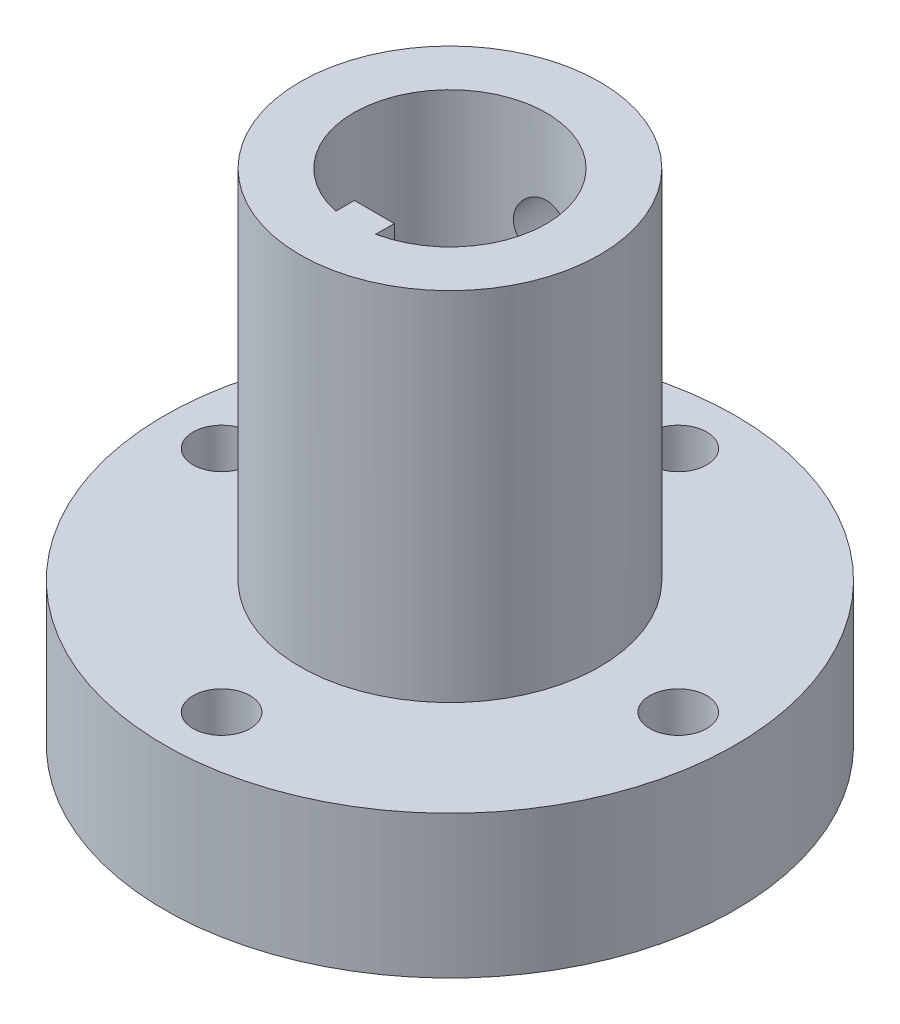
ISO-10303-21;
HEADER;
FILE_DESCRIPTION(('STEP AP214'),'2;1');
FILE_NAME('part.step','',(''),(''),'','','');
FILE_SCHEMA(('AUTOMOTIVE_DESIGN { 1 0 10303 214 1 1 1 1 }'));
ENDSEC;
DATA;
#1=APPLICATION_CONTEXT('core data for automotive mechanical design processes');
#2=APPLICATION_PROTOCOL_DEFINITION('international standard','automotive_design',2000,#1);
#3=PRODUCT_CONTEXT('',#1,'mechanical');
#4=PRODUCT('Part','Part','',(#3));
#5=PRODUCT_RELATED_PRODUCT_CATEGORY('part','',(#4));
#6=PRODUCT_DEFINITION_FORMATION('','',#4);
#7=PRODUCT_DEFINITION_CONTEXT('part definition',#1,'design');
#8=PRODUCT_DEFINITION('design','',#6,#7);
#9=PRODUCT_DEFINITION_SHAPE('','',#8);
#10=(LENGTH_UNIT() NAMED_UNIT(*) SI_UNIT(.MILLI.,.METRE.));
#11=(NAMED_UNIT(*) PLANE_ANGLE_UNIT() SI_UNIT($,.RADIAN.));
#12=(NAMED_UNIT(*) SI_UNIT($,.STERADIAN.) SOLID_ANGLE_UNIT());
#13=UNCERTAINTY_MEASURE_WITH_UNIT(LENGTH_MEASURE(1.E-05),#10,'distance_accuracy_value','');
#14=(GEOMETRIC_REPRESENTATION_CONTEXT(3) GLOBAL_UNCERTAINTY_ASSIGNED_CONTEXT((#13)) GLOBAL_UNIT_ASSIGNED_CONTEXT((#10,
#11,#12)) REPRESENTATION_CONTEXT('',''));
#15=CARTESIAN_POINT('',(0.,0.,0.));
#16=DIRECTION('',(0.,0.,1.));
#17=DIRECTION('',(1.,0.,0.));
#18=AXIS2_PLACEMENT_3D('',#15,#16,#17);
#19=CARTESIAN_POINT('',(0.,25.,0.));
#20=DIRECTION('',(0.,-1.,0.));
#21=DIRECTION('',(0.,0.,-1.));
#22=AXIS2_PLACEMENT_3D('',#19,#20,#21);
#23=CYLINDRICAL_SURFACE('',#22,10.5);
#24=CARTESIAN_POINT('',(0.,19.6872794864012,-10.5));
#25=CARTESIAN_POINT('',(-0.111262673206797,19.6872752701876,-10.4999979743929));
#26=CARTESIAN_POINT('',(-0.222579835098419,19.6779635761118,-10.4982132825978));
#27=CARTESIAN_POINT('',(-0.442075065848081,19.6409881116395,-10.4912658417576));
#28=CARTESIAN_POINT('',(-0.550250443240319,19.613309063957,-10.4861002806795));
#29=CARTESIAN_POINT('',(-0.760256182328712,19.5404789835765,-10.4729686963989));
#30=CARTESIAN_POINT('',(-0.862092256456917,19.4953439532498,-10.4650052387144));
#31=CARTESIAN_POINT('',(-1.05673744629992,19.3889290494087,-10.4471465532496));
#32=CARTESIAN_POINT('',(-1.14954724679715,19.3276504019474,-10.4372514721844));
#33=CARTESIAN_POINT('',(-1.3246595476384,19.1898852206128,-10.4164844504796));
#34=CARTESIAN_POINT('',(-1.40683456028832,19.1132380670267,-10.4056029207544));
#35=CARTESIAN_POINT('',(-1.5572415094345,18.9472570653052,-10.3841602588096));
#36=CARTESIAN_POINT('',(-1.6254724245306,18.8579222886178,-10.3735991501089));
#37=CARTESIAN_POINT('',(-1.74658749191595,18.6681972171956,-10.3538997919733));
#38=CARTESIAN_POINT('',(-1.7993414175367,18.5677223932912,-10.3447739002785));
#39=CARTESIAN_POINT('',(-1.8871712132609,18.3591331437984,-10.3291136064192));
#40=CARTESIAN_POINT('',(-1.92224865908,18.2510194001382,-10.3225789732761));
#41=CARTESIAN_POINT('',(-1.97331952032964,18.0315871436221,-10.3129377029114));
#42=CARTESIAN_POINT('',(-1.98953558464559,17.9203222410495,-10.3097911053349));
#43=CARTESIAN_POINT('',(-2.00311456964474,17.6966098859407,-10.307161743861));
#44=CARTESIAN_POINT('',(-2.00047923584385,17.5841625438534,-10.307678640748));
#45=CARTESIAN_POINT('',(-1.97661064931592,17.3628940236558,-10.3122815009876));
#46=CARTESIAN_POINT('',(-1.95563105143299,17.2540443208275,-10.3163187841917));
#47=CARTESIAN_POINT('',(-1.89606915178378,17.0414384059723,-10.3274310100144));
#48=CARTESIAN_POINT('',(-1.85748608036295,16.9376824168712,-10.3345060854497));
#49=CARTESIAN_POINT('',(-1.76356576724441,16.7374696023801,-10.3509473410172));
#50=CARTESIAN_POINT('',(-1.70812654193732,16.6410618044494,-10.3603273986465));
#51=CARTESIAN_POINT('',(-1.58213972356485,16.4588218282963,-10.3803126085096));
#52=CARTESIAN_POINT('',(-1.51159054979958,16.3729907580202,-10.3909178888643));
#53=CARTESIAN_POINT('',(-1.35602107880719,16.2128755558731,-10.4123704255534));
#54=CARTESIAN_POINT('',(-1.27078393030956,16.1388021091221,-10.4232188107929));
#55=CARTESIAN_POINT('',(-1.08898253988166,16.005973247683,-10.4437767134731));
#56=CARTESIAN_POINT('',(-0.992418177396045,15.9472179960477,-10.4534862187906));
#57=CARTESIAN_POINT('',(-0.790480381930607,15.8466604905628,-10.4706929218926));
#58=CARTESIAN_POINT('',(-0.685095520747788,15.8048806540168,-10.4781871907582));
#59=CARTESIAN_POINT('',(-0.468628740120912,15.7396756646611,-10.4900964856593));
#60=CARTESIAN_POINT('',(-0.357547446987754,15.7162484986037,-10.4945118494381));
#61=CARTESIAN_POINT('',(-0.134653102166432,15.688708282765,-10.4997193000827));
#62=CARTESIAN_POINT('',(-0.0228769320529696,15.684306642901,-10.5005655209332));
#63=CARTESIAN_POINT('',(0.199814110807046,15.6941675916997,-10.498689066668));
#64=CARTESIAN_POINT('',(0.31072902699455,15.7084292327689,-10.4959665727471));
#65=CARTESIAN_POINT('',(0.527630088071935,15.7549720127327,-10.487292340486));
#66=CARTESIAN_POINT('',(0.633648811820643,15.7871066484651,-10.481366867614));
#67=CARTESIAN_POINT('',(0.838793713663826,15.8683243338718,-10.4669484110117));
#68=CARTESIAN_POINT('',(0.937919411636066,15.917408562724,-10.4584552486531));
#69=CARTESIAN_POINT('',(1.12769270122682,16.0317674915758,-10.4397084980025));
#70=CARTESIAN_POINT('',(1.21823250626953,16.0972179281058,-10.4294362000209));
#71=CARTESIAN_POINT('',(1.3871474593601,16.2422141552349,-10.4083178834007));
#72=CARTESIAN_POINT('',(1.46552143121745,16.3217613071115,-10.3974718094254));
#73=CARTESIAN_POINT('',(1.60898057767488,16.4940011358987,-10.376248096682));
#74=CARTESIAN_POINT('',(1.67386852879691,16.5868593007932,-10.3658789338459));
#75=CARTESIAN_POINT('',(1.78712564506345,16.7823270561013,-10.3469557185905));
#76=CARTESIAN_POINT('',(1.83549543592105,16.8849362769536,-10.3384015974216));
#77=CARTESIAN_POINT('',(1.9140659733558,17.0965004584778,-10.3241439661812));
#78=CARTESIAN_POINT('',(1.94435593447319,17.2054213008188,-10.3184264827985));
#79=CARTESIAN_POINT('',(1.98618111220628,17.4269257578773,-10.3104580861843));
#80=CARTESIAN_POINT('',(1.99771852058121,17.5395089429786,-10.3082067678363));
#81=CARTESIAN_POINT('',(2.00163592783615,17.7631656756339,-10.3074466067947));
#82=CARTESIAN_POINT('',(1.99432714952507,17.8742336840773,-10.3088769648064));
#83=CARTESIAN_POINT('',(1.96144230631373,18.0935267825381,-10.3151839360293));
#84=CARTESIAN_POINT('',(1.93586635894473,18.2017518908419,-10.3200605270675));
#85=CARTESIAN_POINT('',(1.86730626858448,18.4121125349562,-10.3326845207864));
#86=CARTESIAN_POINT('',(1.82435686755864,18.5142597599076,-10.3404261915088));
#87=CARTESIAN_POINT('',(1.72230346338687,18.7099479625942,-10.357911918352));
#88=CARTESIAN_POINT('',(1.66319826870575,18.8034883048671,-10.367656122152));
#89=CARTESIAN_POINT('',(1.52943348647548,18.9808643040611,-10.3882370930006));
#90=CARTESIAN_POINT('',(1.45454780090303,19.0645277950812,-10.3990884079132));
#91=CARTESIAN_POINT('',(1.29181816695002,19.2182048264157,-10.4205531347344));
#92=CARTESIAN_POINT('',(1.20397124611784,19.2882152270388,-10.4311664914262));
#93=CARTESIAN_POINT('',(1.01682937761761,19.4132109992668,-10.4510758496987));
#94=CARTESIAN_POINT('',(0.917435200046732,19.4680499818083,-10.4603586261554));
#95=CARTESIAN_POINT('',(0.710697887659053,19.5601623248047,-10.4764315464421));
#96=CARTESIAN_POINT('',(0.603362257508451,19.5974520300429,-10.4832240083557));
#97=CARTESIAN_POINT('',(0.413106685584918,19.6459168592419,-10.49218127144));
#98=CARTESIAN_POINT('',(0.331292443577402,19.6614010713622,-10.4950965973909));
#99=CARTESIAN_POINT('',(0.166328928394717,19.6820838229182,-10.4990066930654));
#100=CARTESIAN_POINT('',(0.0831796911135103,19.6872826384318,-10.5000015143387));
#101=CARTESIAN_POINT('',(0.,19.6872794864012,-10.5));
#102=B_SPLINE_CURVE_WITH_KNOTS('',3,(#24,#25,#26,#27,#28,#29,#30,#31,#32,#33,#34,#35,#36,#37,
#38,#39,#40,#41,#42,#43,#44,#45,#46,#47,#48,#49,#50,#51,#52,#53,#54,#55,#56,#57,#58,#59,#60,#61,
#62,#63,#64,#65,#66,#67,#68,#69,#70,#71,#72,#73,#74,#75,#76,#77,#78,#79,#80,#81,#82,#83,#84,#85,
#86,#87,#88,#89,#90,#91,#92,#93,#94,#95,#96,#97,#98,#99,#100,#101),.UNSPECIFIED.,.T.,.F.,(4,2,2,
2,2,2,2,2,2,2,2,2,2,2,2,2,2,2,2,2,2,2,2,2,2,2,2,2,2,2,2,2,2,2,2,2,2,2,4),(0.,0.33348380243004,
0.667245332623756,1.00070161708277,1.33413258396015,1.67124928303734,2.00839066694811,
2.34829242006153,2.6881638683125,3.0239812313765,3.35976750035631,3.69098283657375,
4.02221265549116,4.35548777386576,4.68879777425772,5.0275329559423,5.36627174310674,
5.70545641749535,6.04460387885447,6.37858849301337,6.71255615038158,7.04382581519731,
7.37511853098563,7.71013402869825,8.04518189550174,8.38482983470167,8.72446490650364,
9.06240989581904,9.40031538398819,9.73267662393089,10.0650357254753,10.3967334632936,
10.7284556713561,11.065300358868,11.4022224167316,11.7422902517103,12.0820407295051,
12.3313590630718,12.5806707044157),.UNSPECIFIED.);
#103=CARTESIAN_POINT('',(0.,19.6872794864012,-10.5));
#104=VERTEX_POINT('',#103);
#105=EDGE_CURVE('E191',#104,#104,#102,.T.);
#106=ORIENTED_EDGE('',*,*,#105,.T.);
#107=EDGE_LOOP('',(#106));
#108=FACE_BOUND('',#107,.T.);
#109=CARTESIAN_POINT('',(0.,25.,0.));
#110=DIRECTION('',(0.,1.,0.));
#111=DIRECTION('',(0.,0.,1.));
#112=AXIS2_PLACEMENT_3D('',#109,#110,#111);
#113=CIRCLE('',#112,10.5);
#114=CARTESIAN_POINT('',(0.,25.,10.5));
#115=VERTEX_POINT('',#114);
#116=EDGE_CURVE('E126',#115,#115,#113,.T.);
#117=ORIENTED_EDGE('',*,*,#116,.F.);
#118=EDGE_LOOP('',(#117));
#119=FACE_BOUND('',#118,.T.);
#120=CARTESIAN_POINT('',(0.,0.,0.));
#121=DIRECTION('',(0.,-1.,0.));
#122=DIRECTION('',(0.,0.,-1.));
#123=AXIS2_PLACEMENT_3D('',#120,#121,#122);
#124=CIRCLE('',#123,10.5);
#125=CARTESIAN_POINT('',(0.,0.,-10.5));
#126=VERTEX_POINT('',#125);
#127=EDGE_CURVE('E121',#126,#126,#124,.T.);
#128=ORIENTED_EDGE('',*,*,#127,.F.);
#129=EDGE_LOOP('',(#128));
#130=FACE_BOUND('',#129,.T.);
#131=ADVANCED_FACE('F37',(#108,#119,#130),#23,.T.);
#132=CARTESIAN_POINT('',(0.,25.,0.));
#133=DIRECTION('',(0.,1.,0.));
#134=DIRECTION('',(0.,0.,1.));
#135=AXIS2_PLACEMENT_3D('',#132,#133,#134);
#136=PLANE('',#135);
#137=CARTESIAN_POINT('',(0.,25.,0.));
#138=DIRECTION('',(0.,1.,0.));
#139=DIRECTION('',(0.,0.,1.));
#140=AXIS2_PLACEMENT_3D('',#137,#138,#139);
#141=CIRCLE('',#140,6.75);
#142=CARTESIAN_POINT('',(1.4,25.,6.60321891201556));
#143=VERTEX_POINT('',#142);
#144=CARTESIAN_POINT('',(-1.4,25.,6.60321891201556));
#145=VERTEX_POINT('',#144);
#146=EDGE_CURVE('E56',#143,#145,#141,.T.);
#147=ORIENTED_EDGE('',*,*,#146,.F.);
#148=DIRECTION('',(0.,0.,-1.));
#149=VECTOR('',#148,1.);
#150=CARTESIAN_POINT('',(1.4,25.,5.3));
#151=LINE('',#150,#149);
#152=CARTESIAN_POINT('',(1.4,25.,5.3));
#153=VERTEX_POINT('',#152);
#154=EDGE_CURVE('E107',#143,#153,#151,.T.);
#155=ORIENTED_EDGE('',*,*,#154,.T.);
#156=DIRECTION('',(-1.,0.,0.));
#157=VECTOR('',#156,1.);
#158=CARTESIAN_POINT('',(-1.4,25.,5.3));
#159=LINE('',#158,#157);
#160=CARTESIAN_POINT('',(-1.4,25.,5.3));
#161=VERTEX_POINT('',#160);
#162=EDGE_CURVE('E95',#153,#161,#159,.T.);
#163=ORIENTED_EDGE('',*,*,#162,.T.);
#164=DIRECTION('',(0.,0.,1.));
#165=VECTOR('',#164,1.);
#166=CARTESIAN_POINT('',(-1.4,25.,5.3));
#167=LINE('',#166,#165);
#168=EDGE_CURVE('E89',#161,#145,#167,.T.);
#169=ORIENTED_EDGE('',*,*,#168,.T.);
#170=EDGE_LOOP('',(#147,#155,#163,#169));
#171=FACE_BOUND('',#170,.T.);
#172=ORIENTED_EDGE('',*,*,#116,.T.);
#173=EDGE_LOOP('',(#172));
#174=FACE_BOUND('',#173,.T.);
#175=ADVANCED_FACE('F131',(#171,#174),#136,.T.);
#176=CARTESIAN_POINT('',(0.,-10.,0.));
#177=DIRECTION('',(0.,1.,0.));
#178=DIRECTION('',(0.,0.,1.));
#179=AXIS2_PLACEMENT_3D('',#176,#177,#178);
#180=CYLINDRICAL_SURFACE('',#179,20.);
#181=CARTESIAN_POINT('',(0.,-10.,0.));
#182=DIRECTION('',(0.,-1.,0.));
#183=DIRECTION('',(0.,0.,-1.));
#184=AXIS2_PLACEMENT_3D('',#181,#182,#183);
#185=CIRCLE('',#184,20.);
#186=CARTESIAN_POINT('',(0.,-10.,-20.));
#187=VERTEX_POINT('',#186);
#188=EDGE_CURVE('E118',#187,#187,#185,.T.);
#189=ORIENTED_EDGE('',*,*,#188,.F.);
#190=EDGE_LOOP('',(#189));
#191=FACE_BOUND('',#190,.T.);
#192=CARTESIAN_POINT('',(0.,0.,0.));
#193=DIRECTION('',(0.,-1.,0.));
#194=DIRECTION('',(0.,0.,-1.));
#195=AXIS2_PLACEMENT_3D('',#192,#193,#194);
#196=CIRCLE('',#195,20.);
#197=CARTESIAN_POINT('',(0.,0.,-20.));
#198=VERTEX_POINT('',#197);
#199=EDGE_CURVE('E116',#198,#198,#196,.T.);
#200=ORIENTED_EDGE('',*,*,#199,.T.);
#201=EDGE_LOOP('',(#200));
#202=FACE_BOUND('',#201,.T.);
#203=ADVANCED_FACE('F146',(#191,#202),#180,.T.);
#204=CARTESIAN_POINT('',(0.,-10.,0.));
#205=DIRECTION('',(0.,-1.,0.));
#206=DIRECTION('',(0.,0.,-1.));
#207=AXIS2_PLACEMENT_3D('',#204,#205,#206);
#208=PLANE('',#207);
#209=CARTESIAN_POINT('',(16.0000000000004,-10.,3.69768473142599E-13));
#210=DIRECTION('',(0.,-1.,0.));
#211=DIRECTION('',(0.,0.,-1.));
#212=AXIS2_PLACEMENT_3D('',#209,#210,#211);
#213=CIRCLE('',#212,2.);
#214=CARTESIAN_POINT('',(16.0000000000004,-10.,-1.99999999999963));
#215=VERTEX_POINT('',#214);
#216=EDGE_CURVE('E201',#215,#215,#213,.T.);
#217=ORIENTED_EDGE('',*,*,#216,.F.);
#218=EDGE_LOOP('',(#217));
#219=FACE_BOUND('',#218,.T.);
#220=CARTESIAN_POINT('',(7.39536946285199E-13,-10.,-16.));
#221=DIRECTION('',(0.,-1.,0.));
#222=DIRECTION('',(0.,0.,-1.));
#223=AXIS2_PLACEMENT_3D('',#220,#221,#222);
#224=CIRCLE('',#223,2.);
#225=CARTESIAN_POINT('',(7.39536946285199E-13,-10.,-18.));
#226=VERTEX_POINT('',#225);
#227=EDGE_CURVE('E207',#226,#226,#224,.T.);
#228=ORIENTED_EDGE('',*,*,#227,.F.);
#229=EDGE_LOOP('',(#228));
#230=FACE_BOUND('',#229,.T.);
#231=CARTESIAN_POINT('',(-15.9999999999996,-10.,-3.71727908021235E-13));
#232=DIRECTION('',(0.,-1.,0.));
#233=DIRECTION('',(0.,0.,-1.));
#234=AXIS2_PLACEMENT_3D('',#231,#232,#233);
#235=CIRCLE('',#234,2.);
#236=CARTESIAN_POINT('',(-15.9999999999996,-10.,-2.00000000000037));
#237=VERTEX_POINT('',#236);
#238=EDGE_CURVE('E196',#237,#237,#235,.T.);
#239=ORIENTED_EDGE('',*,*,#238,.F.);
#240=EDGE_LOOP('',(#239));
#241=FACE_BOUND('',#240,.T.);
#242=CARTESIAN_POINT('',(0.,-10.,16.));
#243=DIRECTION('',(0.,-1.,0.));
#244=DIRECTION('',(0.,0.,-1.));
#245=AXIS2_PLACEMENT_3D('',#242,#243,#244);
#246=CIRCLE('',#245,2.);
#247=CARTESIAN_POINT('',(0.,-10.,14.));
#248=VERTEX_POINT('',#247);
#249=EDGE_CURVE('E200',#248,#248,#246,.T.);
#250=ORIENTED_EDGE('',*,*,#249,.F.);
#251=EDGE_LOOP('',(#250));
#252=FACE_BOUND('',#251,.T.);
#253=DIRECTION('',(0.,0.,-1.));
#254=VECTOR('',#253,1.);
#255=CARTESIAN_POINT('',(1.4,-10.,5.3));
#256=LINE('',#255,#254);
#257=CARTESIAN_POINT('',(1.4,-10.,6.60321891201556));
#258=VERTEX_POINT('',#257);
#259=CARTESIAN_POINT('',(1.4,-10.,5.3));
#260=VERTEX_POINT('',#259);
#261=EDGE_CURVE('E80',#258,#260,#256,.T.);
#262=ORIENTED_EDGE('',*,*,#261,.F.);
#263=CARTESIAN_POINT('',(0.,-10.,0.));
#264=DIRECTION('',(0.,1.,0.));
#265=DIRECTION('',(0.,0.,1.));
#266=AXIS2_PLACEMENT_3D('',#263,#264,#265);
#267=CIRCLE('',#266,6.75);
#268=CARTESIAN_POINT('',(-1.4,-10.,6.60321891201556));
#269=VERTEX_POINT('',#268);
#270=EDGE_CURVE('E114',#258,#269,#267,.T.);
#271=ORIENTED_EDGE('',*,*,#270,.T.);
#272=DIRECTION('',(0.,0.,1.));
#273=VECTOR('',#272,1.);
#274=CARTESIAN_POINT('',(-1.4,-10.,5.3));
#275=LINE('',#274,#273);
#276=CARTESIAN_POINT('',(-1.4,-10.,5.3));
#277=VERTEX_POINT('',#276);
#278=EDGE_CURVE('E97',#277,#269,#275,.T.);
#279=ORIENTED_EDGE('',*,*,#278,.F.);
#280=DIRECTION('',(-1.,0.,0.));
#281=VECTOR('',#280,1.);
#282=CARTESIAN_POINT('',(-1.4,-10.,5.3));
#283=LINE('',#282,#281);
#284=EDGE_CURVE('E88',#260,#277,#283,.T.);
#285=ORIENTED_EDGE('',*,*,#284,.F.);
#286=EDGE_LOOP('',(#262,#271,#279,#285));
#287=FACE_BOUND('',#286,.T.);
#288=ORIENTED_EDGE('',*,*,#188,.T.);
#289=EDGE_LOOP('',(#288));
#290=FACE_BOUND('',#289,.T.);
#291=ADVANCED_FACE('F100',(#219,#230,#241,#252,#287,#290),#208,.T.);
#292=CARTESIAN_POINT('',(0.,0.,0.));
#293=DIRECTION('',(0.,-1.,0.));
#294=DIRECTION('',(0.,0.,-1.));
#295=AXIS2_PLACEMENT_3D('',#292,#293,#294);
#296=PLANE('',#295);
#297=CARTESIAN_POINT('',(16.0000000000004,0.,3.69768473142599E-13));
#298=DIRECTION('',(0.,-1.,0.));
#299=DIRECTION('',(0.,0.,-1.));
#300=AXIS2_PLACEMENT_3D('',#297,#298,#299);
#301=CIRCLE('',#300,2.);
#302=CARTESIAN_POINT('',(16.0000000000004,0.,-1.99999999999963));
#303=VERTEX_POINT('',#302);
#304=EDGE_CURVE('E197',#303,#303,#301,.T.);
#305=ORIENTED_EDGE('',*,*,#304,.T.);
#306=EDGE_LOOP('',(#305));
#307=FACE_BOUND('',#306,.T.);
#308=CARTESIAN_POINT('',(7.39536946285199E-13,0.,-16.));
#309=DIRECTION('',(0.,-1.,0.));
#310=DIRECTION('',(0.,0.,-1.));
#311=AXIS2_PLACEMENT_3D('',#308,#309,#310);
#312=CIRCLE('',#311,2.);
#313=CARTESIAN_POINT('',(7.39536946285199E-13,0.,-18.));
#314=VERTEX_POINT('',#313);
#315=EDGE_CURVE('E204',#314,#314,#312,.T.);
#316=ORIENTED_EDGE('',*,*,#315,.T.);
#317=EDGE_LOOP('',(#316));
#318=FACE_BOUND('',#317,.T.);
#319=CARTESIAN_POINT('',(-15.9999999999996,0.,-3.71727908021235E-13));
#320=DIRECTION('',(0.,-1.,0.));
#321=DIRECTION('',(0.,0.,-1.));
#322=AXIS2_PLACEMENT_3D('',#319,#320,#321);
#323=CIRCLE('',#322,2.);
#324=CARTESIAN_POINT('',(-15.9999999999996,0.,-2.00000000000037));
#325=VERTEX_POINT('',#324);
#326=EDGE_CURVE('E210',#325,#325,#323,.T.);
#327=ORIENTED_EDGE('',*,*,#326,.T.);
#328=EDGE_LOOP('',(#327));
#329=FACE_BOUND('',#328,.T.);
#330=CARTESIAN_POINT('',(0.,0.,16.));
#331=DIRECTION('',(0.,-1.,0.));
#332=DIRECTION('',(0.,0.,-1.));
#333=AXIS2_PLACEMENT_3D('',#330,#331,#332);
#334=CIRCLE('',#333,2.);
#335=CARTESIAN_POINT('',(0.,0.,14.));
#336=VERTEX_POINT('',#335);
#337=EDGE_CURVE('E109',#336,#336,#334,.T.);
#338=ORIENTED_EDGE('',*,*,#337,.T.);
#339=EDGE_LOOP('',(#338));
#340=FACE_BOUND('',#339,.T.);
#341=ORIENTED_EDGE('',*,*,#127,.T.);
#342=EDGE_LOOP('',(#341));
#343=FACE_BOUND('',#342,.T.);
#344=ORIENTED_EDGE('',*,*,#199,.F.);
#345=EDGE_LOOP('',(#344));
#346=FACE_BOUND('',#345,.T.);
#347=ADVANCED_FACE('F138',(#307,#318,#329,#340,#343,#346),#296,.F.);
#348=CARTESIAN_POINT('',(0.,-10.,0.));
#349=DIRECTION('',(0.,1.,0.));
#350=DIRECTION('',(0.,0.,1.));
#351=AXIS2_PLACEMENT_3D('',#348,#349,#350);
#352=CYLINDRICAL_SURFACE('',#351,6.75);
#353=CARTESIAN_POINT('',(2.,17.6872794864012,-6.44689847911381));
#354=CARTESIAN_POINT('',(1.99999846607041,17.5776183729902,-6.44689972904362));
#355=CARTESIAN_POINT('',(1.99095014770943,17.4679420342229,-6.44972708286862));
#356=CARTESIAN_POINT('',(1.95508626863117,17.2517913077561,-6.46068718599053));
#357=CARTESIAN_POINT('',(1.92826443562321,17.145318064304,-6.46882180821199));
#358=CARTESIAN_POINT('',(1.85784055045441,16.9387336216716,-6.48939601196571));
#359=CARTESIAN_POINT('',(1.81426589687247,16.8386123439638,-6.50182856107771));
#360=CARTESIAN_POINT('',(1.71166288591019,16.6470775967473,-6.52958833110086));
#361=CARTESIAN_POINT('',(1.65263233910791,16.5556653634323,-6.5449159620323));
#362=CARTESIAN_POINT('',(1.51884243775902,16.3813216889275,-6.57726947667086));
#363=CARTESIAN_POINT('',(1.44368945066539,16.298698836428,-6.5943308611684));
#364=CARTESIAN_POINT('',(1.28063190373645,16.1470253580989,-6.62792587345445));
#365=CARTESIAN_POINT('',(1.1927257465832,16.0779764349412,-6.64445943481686));
#366=CARTESIAN_POINT('',(1.00446839247039,15.954077075861,-6.67553834817589));
#367=CARTESIAN_POINT('',(0.90390233367672,15.8995403671137,-6.69003698849382));
#368=CARTESIAN_POINT('',(0.694524206545664,15.8082717370596,-6.71500059468101));
#369=CARTESIAN_POINT('',(0.585713876357655,15.7715360747492,-6.72546640797984));
#370=CARTESIAN_POINT('',(0.366163539778514,15.7179309236997,-6.74093397538356));
#371=CARTESIAN_POINT('',(0.255562455973248,15.7005349062291,-6.74608026503139));
#372=CARTESIAN_POINT('',(0.0328997946804897,15.6844389337288,-6.75083751400717));
#373=CARTESIAN_POINT('',(-0.0791614786172708,15.6857351449933,-6.75044960837789));
#374=CARTESIAN_POINT('',(-0.297873045461224,15.7066313851485,-6.74428477640622));
#375=CARTESIAN_POINT('',(-0.404583274078028,15.7256613886528,-6.73867568333063));
#376=CARTESIAN_POINT('',(-0.61322135638929,15.7805550793345,-6.72290200044573));
#377=CARTESIAN_POINT('',(-0.715148909704239,15.8164198222778,-6.71273712492901));
#378=CARTESIAN_POINT('',(-0.912694870822389,15.9043566987376,-6.68876003521547));
#379=CARTESIAN_POINT('',(-1.00822754039634,15.9566099461713,-6.6749073380918));
#380=CARTESIAN_POINT('',(-1.18935223993799,16.0756978224532,-6.64502671265718));
#381=CARTESIAN_POINT('',(-1.27494195093819,16.1425358424453,-6.62899827878806));
#382=CARTESIAN_POINT('',(-1.43715339256308,16.291860673011,-6.5957719956678));
#383=CARTESIAN_POINT('',(-1.51331629819767,16.3748418163998,-6.578552838242));
#384=CARTESIAN_POINT('',(-1.65077296100481,16.5525679660289,-6.54541527980348));
#385=CARTESIAN_POINT('',(-1.71206531493295,16.6473140811842,-6.52949700164083));
#386=CARTESIAN_POINT('',(-1.81850391062729,16.8470635392369,-6.5006634520077));
#387=CARTESIAN_POINT('',(-1.86349725429701,16.9521528180071,-6.48777699641758));
#388=CARTESIAN_POINT('',(-1.93501410213598,17.1688865175067,-6.4668095083731));
#389=CARTESIAN_POINT('',(-1.96154345808207,17.2805288492078,-6.458726953541));
#390=CARTESIAN_POINT('',(-1.9945294856425,17.5028413912319,-6.44861541887427));
#391=CARTESIAN_POINT('',(-2.00168211157734,17.6133988840501,-6.44637665971193));
#392=CARTESIAN_POINT('',(-1.99765213718615,17.8341365754089,-6.44762681346732));
#393=CARTESIAN_POINT('',(-1.98647202854436,17.944316823183,-6.4511149480173));
#394=CARTESIAN_POINT('',(-1.94671307078804,18.1582959563211,-6.46322033774288));
#395=CARTESIAN_POINT('',(-1.91857891207318,18.2621856433516,-6.47170637727763));
#396=CARTESIAN_POINT('',(-1.84622426766693,18.4637641016559,-6.49271636457804));
#397=CARTESIAN_POINT('',(-1.80200134011565,18.5614519290028,-6.50524092525415));
#398=CARTESIAN_POINT('',(-1.69739376772785,18.750693638191,-6.53332629943475));
#399=CARTESIAN_POINT('',(-1.63661472659275,18.8420186832228,-6.54895829153709));
#400=CARTESIAN_POINT('',(-1.50109092758591,19.0134278787622,-6.58134266558543));
#401=CARTESIAN_POINT('',(-1.42634291001058,19.0935093979041,-6.59809530845169));
#402=CARTESIAN_POINT('',(-1.26173706969618,19.24318424216,-6.63157718105595));
#403=CARTESIAN_POINT('',(-1.17142554054507,19.3122850379438,-6.64828300658009));
#404=CARTESIAN_POINT('',(-0.980092606088129,19.4343607761287,-6.67916872538546));
#405=CARTESIAN_POINT('',(-0.879071742099445,19.4873365330672,-6.69334874623973));
#406=CARTESIAN_POINT('',(-0.669865553842993,19.5751478827296,-6.71749738986508));
#407=CARTESIAN_POINT('',(-0.561741239476527,19.6101197237167,-6.72749753281052));
#408=CARTESIAN_POINT('',(-0.340801864658222,19.6612861731702,-6.74229890056853));
#409=CARTESIAN_POINT('',(-0.227988119406828,19.6774860101258,-6.74710157298655));
#410=CARTESIAN_POINT('',(-0.00542937744677866,19.6902589362278,-6.75088101276676));
#411=CARTESIAN_POINT('',(0.104271489295588,19.6875471677879,-6.75007006789687));
#412=CARTESIAN_POINT('',(0.321587365674696,19.6642777297156,-6.7432113801433));
#413=CARTESIAN_POINT('',(0.429202488300315,19.6437210295565,-6.73716392174711));
#414=CARTESIAN_POINT('',(0.638221172237381,19.5857838421462,-6.72057019837261));
#415=CARTESIAN_POINT('',(0.739677095175011,19.5485779560252,-6.71007068087254));
#416=CARTESIAN_POINT('',(0.934960348747976,19.4585544066823,-6.68565958802236));
#417=CARTESIAN_POINT('',(1.02878644045404,19.4057342144439,-6.67174746000102));
#418=CARTESIAN_POINT('',(1.20934957464138,19.2840560519011,-6.64143231316773));
#419=CARTESIAN_POINT('',(1.29577129244648,19.2147463586593,-6.62496476981675));
#420=CARTESIAN_POINT('',(1.45599693162364,19.0628750735931,-6.59160708709455));
#421=CARTESIAN_POINT('',(1.52979724624712,18.9803097067929,-6.57471682850174));
#422=CARTESIAN_POINT('',(1.66482115361527,18.8014101052735,-6.54185352326619));
#423=CARTESIAN_POINT('',(1.72562031012002,18.7047472676583,-6.52592101567633));
#424=CARTESIAN_POINT('',(1.83003188308774,18.5021155810752,-6.49741717004373));
#425=CARTESIAN_POINT('',(1.87365292367937,18.3961514345122,-6.48484414642224));
#426=CARTESIAN_POINT('',(1.93832761974431,18.1904199806409,-6.46578599792043));
#427=CARTESIAN_POINT('',(1.96139219852312,18.0913306874007,-6.45876893992762));
#428=CARTESIAN_POINT('',(1.99222765835013,17.8905914624745,-6.44932503373723));
#429=CARTESIAN_POINT('',(2.00000142204615,17.7889420170925,-6.44689732035276));
#430=CARTESIAN_POINT('',(2.,17.6872794864012,-6.44689847911381));
#431=B_SPLINE_CURVE_WITH_KNOTS('',3,(#353,#354,#355,#356,#357,#358,#359,#360,#361,#362,#363,
#364,#365,#366,#367,#368,#369,#370,#371,#372,#373,#374,#375,#376,#377,#378,#379,#380,#381,#382,
#383,#384,#385,#386,#387,#388,#389,#390,#391,#392,#393,#394,#395,#396,#397,#398,#399,#400,#401,
#402,#403,#404,#405,#406,#407,#408,#409,#410,#411,#412,#413,#414,#415,#416,#417,#418,#419,#420,
#421,#422,#423,#424,#425,#426,#427,#428,#429,#430),.UNSPECIFIED.,.T.,.F.,(4,2,2,2,2,2,2,2,2,2,2,
2,2,2,2,2,2,2,2,2,2,2,2,2,2,2,2,2,2,2,2,2,2,2,2,2,2,2,4),(0.,0.328608466249891,
0.657332960551424,0.985522110250248,1.31375777512832,1.65117098571581,1.9886264934118,
2.33287362567199,2.67704838078909,3.01160408581102,3.34609117569481,3.67018439656887,
3.99429794518993,4.32212767620412,4.65003371314651,4.99028233136956,5.33056304432876,
5.67395790952513,6.01724389324221,6.34802558225912,6.67876231697818,7.00118027877214,
7.3236471957202,7.65459340052135,7.98561692928694,8.32878399726884,8.67193372769133,
9.01244695039549,9.35286530853852,9.6804824685252,10.0080818309558,10.3323233460062,
10.6566174065792,10.9910997898628,11.3256775971911,11.6699113954334,12.0139721529971,
12.3186696616058,12.623309722667),.UNSPECIFIED.);
#432=CARTESIAN_POINT('',(2.,17.6872794864012,-6.44689847911381));
#433=VERTEX_POINT('',#432);
#434=EDGE_CURVE('E41',#433,#433,#431,.T.);
#435=ORIENTED_EDGE('',*,*,#434,.T.);
#436=EDGE_LOOP('',(#435));
#437=FACE_BOUND('',#436,.T.);
#438=ORIENTED_EDGE('',*,*,#270,.F.);
#439=DIRECTION('',(0.,1.,0.));
#440=VECTOR('',#439,1.);
#441=CARTESIAN_POINT('',(1.4,-10.,6.60321891201556));
#442=LINE('',#441,#440);
#443=EDGE_CURVE('E11',#258,#143,#442,.T.);
#444=ORIENTED_EDGE('',*,*,#443,.T.);
#445=ORIENTED_EDGE('',*,*,#146,.T.);
#446=DIRECTION('',(0.,1.,0.));
#447=VECTOR('',#446,1.);
#448=CARTESIAN_POINT('',(-1.4,-10.,6.60321891201556));
#449=LINE('',#448,#447);
#450=EDGE_CURVE('E50',#145,#269,#449,.F.);
#451=ORIENTED_EDGE('',*,*,#450,.T.);
#452=EDGE_LOOP('',(#438,#444,#445,#451));
#453=FACE_BOUND('',#452,.T.);
#454=ADVANCED_FACE('F141',(#437,#453),#352,.F.);
#455=CARTESIAN_POINT('',(1.4,-10.,5.3));
#456=DIRECTION('',(1.,0.,0.));
#457=DIRECTION('',(0.,0.,-1.));
#458=AXIS2_PLACEMENT_3D('',#455,#456,#457);
#459=PLANE('',#458);
#460=ORIENTED_EDGE('',*,*,#443,.F.);
#461=ORIENTED_EDGE('',*,*,#261,.T.);
#462=DIRECTION('',(0.,1.,0.));
#463=VECTOR('',#462,1.);
#464=CARTESIAN_POINT('',(1.4,-10.,5.3));
#465=LINE('',#464,#463);
#466=EDGE_CURVE('E84',#260,#153,#465,.T.);
#467=ORIENTED_EDGE('',*,*,#466,.T.);
#468=ORIENTED_EDGE('',*,*,#154,.F.);
#469=EDGE_LOOP('',(#460,#461,#467,#468));
#470=FACE_BOUND('',#469,.T.);
#471=ADVANCED_FACE('F82',(#470),#459,.T.);
#472=CARTESIAN_POINT('',(-1.4,-10.,5.3));
#473=DIRECTION('',(-1.,0.,0.));
#474=DIRECTION('',(0.,0.,1.));
#475=AXIS2_PLACEMENT_3D('',#472,#473,#474);
#476=PLANE('',#475);
#477=ORIENTED_EDGE('',*,*,#450,.F.);
#478=ORIENTED_EDGE('',*,*,#168,.F.);
#479=DIRECTION('',(0.,1.,0.));
#480=VECTOR('',#479,1.);
#481=CARTESIAN_POINT('',(-1.4,-10.,5.3));
#482=LINE('',#481,#480);
#483=EDGE_CURVE('E96',#277,#161,#482,.T.);
#484=ORIENTED_EDGE('',*,*,#483,.F.);
#485=ORIENTED_EDGE('',*,*,#278,.T.);
#486=EDGE_LOOP('',(#477,#478,#484,#485));
#487=FACE_BOUND('',#486,.T.);
#488=ADVANCED_FACE('F164',(#487),#476,.T.);
#489=CARTESIAN_POINT('',(-1.4,-10.,5.3));
#490=DIRECTION('',(0.,0.,-1.));
#491=DIRECTION('',(-1.,0.,0.));
#492=AXIS2_PLACEMENT_3D('',#489,#490,#491);
#493=PLANE('',#492);
#494=ORIENTED_EDGE('',*,*,#162,.F.);
#495=ORIENTED_EDGE('',*,*,#466,.F.);
#496=ORIENTED_EDGE('',*,*,#284,.T.);
#497=ORIENTED_EDGE('',*,*,#483,.T.);
#498=EDGE_LOOP('',(#494,#495,#496,#497));
#499=FACE_BOUND('',#498,.T.);
#500=ADVANCED_FACE('F93',(#499),#493,.T.);
#501=CARTESIAN_POINT('',(0.,0.,16.));
#502=DIRECTION('',(0.,-1.,0.));
#503=DIRECTION('',(0.,0.,-1.));
#504=AXIS2_PLACEMENT_3D('',#501,#502,#503);
#505=CYLINDRICAL_SURFACE('',#504,2.);
#506=ORIENTED_EDGE('',*,*,#337,.F.);
#507=EDGE_LOOP('',(#506));
#508=FACE_BOUND('',#507,.T.);
#509=ORIENTED_EDGE('',*,*,#249,.T.);
#510=EDGE_LOOP('',(#509));
#511=FACE_BOUND('',#510,.T.);
#512=ADVANCED_FACE('F167',(#508,#511),#505,.F.);
#513=CARTESIAN_POINT('',(-15.9999999999996,0.,-3.71727908021235E-13));
#514=DIRECTION('',(0.,-1.,0.));
#515=DIRECTION('',(0.,0.,-1.));
#516=AXIS2_PLACEMENT_3D('',#513,#514,#515);
#517=CYLINDRICAL_SURFACE('',#516,2.);
#518=ORIENTED_EDGE('',*,*,#326,.F.);
#519=EDGE_LOOP('',(#518));
#520=FACE_BOUND('',#519,.T.);
#521=ORIENTED_EDGE('',*,*,#238,.T.);
#522=EDGE_LOOP('',(#521));
#523=FACE_BOUND('',#522,.T.);
#524=ADVANCED_FACE('F173',(#520,#523),#517,.F.);
#525=CARTESIAN_POINT('',(7.39536946285199E-13,0.,-16.));
#526=DIRECTION('',(0.,-1.,0.));
#527=DIRECTION('',(0.,0.,-1.));
#528=AXIS2_PLACEMENT_3D('',#525,#526,#527);
#529=CYLINDRICAL_SURFACE('',#528,2.);
#530=ORIENTED_EDGE('',*,*,#315,.F.);
#531=EDGE_LOOP('',(#530));
#532=FACE_BOUND('',#531,.T.);
#533=ORIENTED_EDGE('',*,*,#227,.T.);
#534=EDGE_LOOP('',(#533));
#535=FACE_BOUND('',#534,.T.);
#536=ADVANCED_FACE('F177',(#532,#535),#529,.F.);
#537=CARTESIAN_POINT('',(16.0000000000004,0.,3.69768473142599E-13));
#538=DIRECTION('',(0.,-1.,0.));
#539=DIRECTION('',(0.,0.,-1.));
#540=AXIS2_PLACEMENT_3D('',#537,#538,#539);
#541=CYLINDRICAL_SURFACE('',#540,2.);
#542=ORIENTED_EDGE('',*,*,#304,.F.);
#543=EDGE_LOOP('',(#542));
#544=FACE_BOUND('',#543,.T.);
#545=ORIENTED_EDGE('',*,*,#216,.T.);
#546=EDGE_LOOP('',(#545));
#547=FACE_BOUND('',#546,.T.);
#548=ADVANCED_FACE('F181',(#544,#547),#541,.F.);
#549=CARTESIAN_POINT('',(0.,17.6872794864012,-20.));
#550=DIRECTION('',(0.,0.,1.));
#551=DIRECTION('',(1.,0.,0.));
#552=AXIS2_PLACEMENT_3D('',#549,#550,#551);
#553=CYLINDRICAL_SURFACE('',#552,2.);
#554=ORIENTED_EDGE('',*,*,#434,.F.);
#555=EDGE_LOOP('',(#554));
#556=FACE_BOUND('',#555,.T.);
#557=ORIENTED_EDGE('',*,*,#105,.F.);
#558=EDGE_LOOP('',(#557));
#559=FACE_BOUND('',#558,.T.);
#560=ADVANCED_FACE('F184',(#556,#559),#553,.F.);
#561=CLOSED_SHELL('',(#131,#175,#203,#291,#347,#454,#471,#488,#500,#512,#524,#536,#548,#560));
#562=MANIFOLD_SOLID_BREP('B2',#561);
#563=ADVANCED_BREP_SHAPE_REPRESENTATION('',(#18,#562),#14);
#564=SHAPE_DEFINITION_REPRESENTATION(#9,#563);
ENDSEC;
END-ISO-10303-21;
